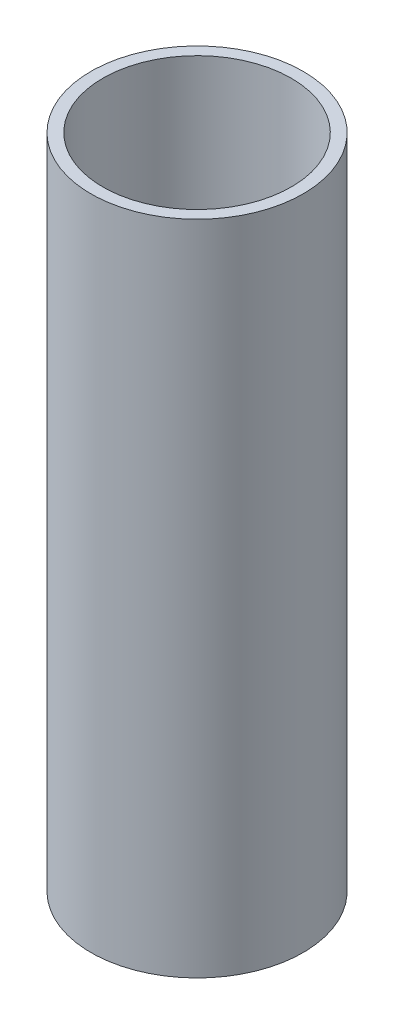
ISO-10303-21;
HEADER;
FILE_DESCRIPTION(('STEP AP214'),'2;1');
FILE_NAME('part.step','',(''),(''),'','','');
FILE_SCHEMA(('AUTOMOTIVE_DESIGN { 1 0 10303 214 1 1 1 1 }'));
ENDSEC;
DATA;
#1=APPLICATION_CONTEXT('core data for automotive mechanical design processes');
#2=APPLICATION_PROTOCOL_DEFINITION('international standard','automotive_design',2000,#1);
#3=PRODUCT_CONTEXT('',#1,'mechanical');
#4=PRODUCT('Part','Part','',(#3));
#5=PRODUCT_RELATED_PRODUCT_CATEGORY('part','',(#4));
#6=PRODUCT_DEFINITION_FORMATION('','',#4);
#7=PRODUCT_DEFINITION_CONTEXT('part definition',#1,'design');
#8=PRODUCT_DEFINITION('design','',#6,#7);
#9=PRODUCT_DEFINITION_SHAPE('','',#8);
#10=(LENGTH_UNIT() NAMED_UNIT(*) SI_UNIT(.MILLI.,.METRE.));
#11=(NAMED_UNIT(*) PLANE_ANGLE_UNIT() SI_UNIT($,.RADIAN.));
#12=(NAMED_UNIT(*) SI_UNIT($,.STERADIAN.) SOLID_ANGLE_UNIT());
#13=UNCERTAINTY_MEASURE_WITH_UNIT(LENGTH_MEASURE(1.E-05),#10,'distance_accuracy_value','');
#14=(GEOMETRIC_REPRESENTATION_CONTEXT(3) GLOBAL_UNCERTAINTY_ASSIGNED_CONTEXT((#13)) GLOBAL_UNIT_ASSIGNED_CONTEXT((#10,
#11,#12)) REPRESENTATION_CONTEXT('',''));
#15=CARTESIAN_POINT('',(0.,0.,0.));
#16=DIRECTION('',(0.,0.,1.));
#17=DIRECTION('',(1.,0.,0.));
#18=AXIS2_PLACEMENT_3D('',#15,#16,#17);
#19=CARTESIAN_POINT('',(13.6326591615901,49.14,-6.07942908557396));
#20=DIRECTION('',(0.,1.,0.));
#21=DIRECTION('',(0.,0.,1.));
#22=AXIS2_PLACEMENT_3D('',#19,#20,#21);
#23=PLANE('',#22);
#24=CARTESIAN_POINT('',(13.6326591615901,49.14,-6.07942908557396));
#25=DIRECTION('',(0.,1.,0.));
#26=DIRECTION('',(0.,0.,1.));
#27=AXIS2_PLACEMENT_3D('',#24,#25,#26);
#28=CIRCLE('',#27,7.9375);
#29=CARTESIAN_POINT('',(13.6326591615901,49.14,-14.016929085574));
#30=VERTEX_POINT('',#29);
#31=EDGE_CURVE('E10',#30,#30,#28,.T.);
#32=ORIENTED_EDGE('',*,*,#31,.T.);
#33=EDGE_LOOP('',(#32));
#34=FACE_BOUND('',#33,.T.);
#35=CARTESIAN_POINT('',(13.6326591615901,49.14,-6.07942908557396));
#36=DIRECTION('',(0.,1.,0.));
#37=DIRECTION('',(0.,0.,1.));
#38=AXIS2_PLACEMENT_3D('',#35,#36,#37);
#39=CIRCLE('',#38,7.0485);
#40=CARTESIAN_POINT('',(13.6326591615901,49.14,-13.127929085574));
#41=VERTEX_POINT('',#40);
#42=EDGE_CURVE('E42',#41,#41,#39,.T.);
#43=ORIENTED_EDGE('',*,*,#42,.F.);
#44=EDGE_LOOP('',(#43));
#45=FACE_BOUND('',#44,.T.);
#46=ADVANCED_FACE('F31',(#34,#45),#23,.T.);
#47=CARTESIAN_POINT('',(13.6326591615901,0.,-6.07942908557396));
#48=DIRECTION('',(0.,1.,0.));
#49=DIRECTION('',(0.,0.,1.));
#50=AXIS2_PLACEMENT_3D('',#47,#48,#49);
#51=PLANE('',#50);
#52=CARTESIAN_POINT('',(13.6326591615901,0.,-6.07942908557396));
#53=DIRECTION('',(0.,1.,0.));
#54=DIRECTION('',(0.,0.,1.));
#55=AXIS2_PLACEMENT_3D('',#52,#53,#54);
#56=CIRCLE('',#55,7.9375);
#57=CARTESIAN_POINT('',(13.6326591615901,0.,-14.016929085574));
#58=VERTEX_POINT('',#57);
#59=EDGE_CURVE('E35',#58,#58,#56,.T.);
#60=ORIENTED_EDGE('',*,*,#59,.F.);
#61=EDGE_LOOP('',(#60));
#62=FACE_BOUND('',#61,.T.);
#63=CARTESIAN_POINT('',(13.6326591615901,0.,-6.07942908557396));
#64=DIRECTION('',(0.,1.,0.));
#65=DIRECTION('',(0.,0.,1.));
#66=AXIS2_PLACEMENT_3D('',#63,#64,#65);
#67=CIRCLE('',#66,7.0485);
#68=CARTESIAN_POINT('',(13.6326591615901,0.,-13.127929085574));
#69=VERTEX_POINT('',#68);
#70=EDGE_CURVE('E44',#69,#69,#67,.T.);
#71=ORIENTED_EDGE('',*,*,#70,.T.);
#72=EDGE_LOOP('',(#71));
#73=FACE_BOUND('',#72,.T.);
#74=ADVANCED_FACE('F54',(#62,#73),#51,.F.);
#75=CARTESIAN_POINT('',(13.6326591615901,49.14,-6.07942908557396));
#76=DIRECTION('',(0.,-1.,0.));
#77=DIRECTION('',(0.,0.,-1.));
#78=AXIS2_PLACEMENT_3D('',#75,#76,#77);
#79=CYLINDRICAL_SURFACE('',#78,7.9375);
#80=CARTESIAN_POINT('',(13.6326591615901,49.14,-14.016929085574));
#81=CARTESIAN_POINT('',(13.6326591615901,48.628125,-14.016929085574));
#82=CARTESIAN_POINT('',(13.6326591615901,48.11625,-14.016929085574));
#83=CARTESIAN_POINT('',(13.6326591615901,47.0925,-14.016929085574));
#84=CARTESIAN_POINT('',(13.6326591615901,46.580625,-14.016929085574));
#85=CARTESIAN_POINT('',(13.6326591615901,45.556875,-14.016929085574));
#86=CARTESIAN_POINT('',(13.6326591615901,45.045,-14.016929085574));
#87=CARTESIAN_POINT('',(13.6326591615901,44.02125,-14.016929085574));
#88=CARTESIAN_POINT('',(13.6326591615901,43.509375,-14.016929085574));
#89=CARTESIAN_POINT('',(13.6326591615901,42.485625,-14.016929085574));
#90=CARTESIAN_POINT('',(13.6326591615901,41.97375,-14.016929085574));
#91=CARTESIAN_POINT('',(13.6326591615901,40.95,-14.016929085574));
#92=CARTESIAN_POINT('',(13.6326591615901,40.438125,-14.016929085574));
#93=CARTESIAN_POINT('',(13.6326591615901,39.414375,-14.016929085574));
#94=CARTESIAN_POINT('',(13.6326591615901,38.9025,-14.016929085574));
#95=CARTESIAN_POINT('',(13.6326591615901,37.87875,-14.016929085574));
#96=CARTESIAN_POINT('',(13.6326591615901,37.366875,-14.016929085574));
#97=CARTESIAN_POINT('',(13.6326591615901,36.343125,-14.016929085574));
#98=CARTESIAN_POINT('',(13.6326591615901,35.83125,-14.016929085574));
#99=CARTESIAN_POINT('',(13.6326591615901,34.8075,-14.016929085574));
#100=CARTESIAN_POINT('',(13.6326591615901,34.295625,-14.016929085574));
#101=CARTESIAN_POINT('',(13.6326591615901,33.271875,-14.016929085574));
#102=CARTESIAN_POINT('',(13.6326591615901,32.76,-14.016929085574));
#103=CARTESIAN_POINT('',(13.6326591615901,31.73625,-14.016929085574));
#104=CARTESIAN_POINT('',(13.6326591615901,31.224375,-14.016929085574));
#105=CARTESIAN_POINT('',(13.6326591615901,30.200625,-14.016929085574));
#106=CARTESIAN_POINT('',(13.6326591615901,29.68875,-14.016929085574));
#107=CARTESIAN_POINT('',(13.6326591615901,28.665,-14.016929085574));
#108=CARTESIAN_POINT('',(13.6326591615901,28.153125,-14.016929085574));
#109=CARTESIAN_POINT('',(13.6326591615901,27.129375,-14.016929085574));
#110=CARTESIAN_POINT('',(13.6326591615901,26.6175,-14.016929085574));
#111=CARTESIAN_POINT('',(13.6326591615901,25.59375,-14.016929085574));
#112=CARTESIAN_POINT('',(13.6326591615901,25.081875,-14.016929085574));
#113=CARTESIAN_POINT('',(13.6326591615901,24.058125,-14.016929085574));
#114=CARTESIAN_POINT('',(13.6326591615901,23.54625,-14.016929085574));
#115=CARTESIAN_POINT('',(13.6326591615901,22.5225,-14.016929085574));
#116=CARTESIAN_POINT('',(13.6326591615901,22.010625,-14.016929085574));
#117=CARTESIAN_POINT('',(13.6326591615901,20.986875,-14.016929085574));
#118=CARTESIAN_POINT('',(13.6326591615901,20.475,-14.016929085574));
#119=CARTESIAN_POINT('',(13.6326591615901,19.45125,-14.016929085574));
#120=CARTESIAN_POINT('',(13.6326591615901,18.939375,-14.016929085574));
#121=CARTESIAN_POINT('',(13.6326591615901,17.915625,-14.016929085574));
#122=CARTESIAN_POINT('',(13.6326591615901,17.40375,-14.016929085574));
#123=CARTESIAN_POINT('',(13.6326591615901,16.38,-14.016929085574));
#124=CARTESIAN_POINT('',(13.6326591615901,15.868125,-14.016929085574));
#125=CARTESIAN_POINT('',(13.6326591615901,14.844375,-14.016929085574));
#126=CARTESIAN_POINT('',(13.6326591615901,14.3325,-14.016929085574));
#127=CARTESIAN_POINT('',(13.6326591615901,13.30875,-14.016929085574));
#128=CARTESIAN_POINT('',(13.6326591615901,12.796875,-14.016929085574));
#129=CARTESIAN_POINT('',(13.6326591615901,11.773125,-14.016929085574));
#130=CARTESIAN_POINT('',(13.6326591615901,11.26125,-14.016929085574));
#131=CARTESIAN_POINT('',(13.6326591615901,10.2375,-14.016929085574));
#132=CARTESIAN_POINT('',(13.6326591615901,9.725625,-14.016929085574));
#133=CARTESIAN_POINT('',(13.6326591615901,8.70187499999999,-14.016929085574));
#134=CARTESIAN_POINT('',(13.6326591615901,8.18999999999999,-14.016929085574));
#135=CARTESIAN_POINT('',(13.6326591615901,7.16624999999999,-14.016929085574));
#136=CARTESIAN_POINT('',(13.6326591615901,6.65437499999999,-14.016929085574));
#137=CARTESIAN_POINT('',(13.6326591615901,5.630625,-14.016929085574));
#138=CARTESIAN_POINT('',(13.6326591615901,5.11875,-14.016929085574));
#139=CARTESIAN_POINT('',(13.6326591615901,4.09499999999999,-14.016929085574));
#140=CARTESIAN_POINT('',(13.6326591615901,3.58312499999999,-14.016929085574));
#141=CARTESIAN_POINT('',(13.6326591615901,2.55937499999999,-14.016929085574));
#142=CARTESIAN_POINT('',(13.6326591615901,2.04749999999999,-14.016929085574));
#143=CARTESIAN_POINT('',(13.6326591615901,1.02374999999999,-14.016929085574));
#144=CARTESIAN_POINT('',(13.6326591615901,0.511874999999993,-14.016929085574));
#145=CARTESIAN_POINT('',(13.6326591615901,0.,-14.016929085574));
#146=B_SPLINE_CURVE_WITH_KNOTS('',3,(#80,#81,#82,#83,#84,#85,#86,#87,#88,#89,#90,#91,#92,#93,
#94,#95,#96,#97,#98,#99,#100,#101,#102,#103,#104,#105,#106,#107,#108,#109,#110,#111,#112,#113,
#114,#115,#116,#117,#118,#119,#120,#121,#122,#123,#124,#125,#126,#127,#128,#129,#130,#131,#132,
#133,#134,#135,#136,#137,#138,#139,#140,#141,#142,#143,#144,#145),.UNSPECIFIED.,.F.,.F.,(4,2,2,
2,2,2,2,2,2,2,2,2,2,2,2,2,2,2,2,2,2,2,2,2,2,2,2,2,2,2,2,2,4),(0.,1.535625,3.07125,4.606875,
6.14249999999999,7.678125,9.21375,10.749375,12.285,13.820625,15.35625,16.891875,18.4275,
19.963125,21.49875,23.034375,24.57,26.105625,27.64125,29.176875,30.7125,32.248125,33.78375,
35.319375,36.855,38.390625,39.92625,41.461875,42.9975,44.533125,46.06875,47.604375,49.14),.UNSPECIFIED.);
#147=EDGE_CURVE('BSEAM33',#30,#58,#146,.T.);
#148=ORIENTED_EDGE('',*,*,#31,.F.);
#149=ORIENTED_EDGE('',*,*,#59,.T.);
#150=ORIENTED_EDGE('',*,*,#147,.T.);
#151=ORIENTED_EDGE('',*,*,#147,.F.);
#152=EDGE_LOOP('',(#148,#150,#149,#151));
#153=FACE_BOUND('',#152,.T.);
#154=ADVANCED_FACE('F33',(#153),#79,.T.);
#155=CARTESIAN_POINT('',(13.6326591615901,49.14,-6.07942908557396));
#156=DIRECTION('',(0.,-1.,0.));
#157=DIRECTION('',(0.,0.,-1.));
#158=AXIS2_PLACEMENT_3D('',#155,#156,#157);
#159=CYLINDRICAL_SURFACE('',#158,7.0485);
#160=CARTESIAN_POINT('',(13.6326591615901,49.14,-13.127929085574));
#161=CARTESIAN_POINT('',(13.6326591615901,48.628125,-13.127929085574));
#162=CARTESIAN_POINT('',(13.6326591615901,48.11625,-13.127929085574));
#163=CARTESIAN_POINT('',(13.6326591615901,47.0925,-13.127929085574));
#164=CARTESIAN_POINT('',(13.6326591615901,46.580625,-13.127929085574));
#165=CARTESIAN_POINT('',(13.6326591615901,45.556875,-13.127929085574));
#166=CARTESIAN_POINT('',(13.6326591615901,45.045,-13.127929085574));
#167=CARTESIAN_POINT('',(13.6326591615901,44.02125,-13.127929085574));
#168=CARTESIAN_POINT('',(13.6326591615901,43.509375,-13.127929085574));
#169=CARTESIAN_POINT('',(13.6326591615901,42.485625,-13.127929085574));
#170=CARTESIAN_POINT('',(13.6326591615901,41.97375,-13.127929085574));
#171=CARTESIAN_POINT('',(13.6326591615901,40.95,-13.127929085574));
#172=CARTESIAN_POINT('',(13.6326591615901,40.438125,-13.127929085574));
#173=CARTESIAN_POINT('',(13.6326591615901,39.414375,-13.127929085574));
#174=CARTESIAN_POINT('',(13.6326591615901,38.9025,-13.127929085574));
#175=CARTESIAN_POINT('',(13.6326591615901,37.87875,-13.127929085574));
#176=CARTESIAN_POINT('',(13.6326591615901,37.366875,-13.127929085574));
#177=CARTESIAN_POINT('',(13.6326591615901,36.343125,-13.127929085574));
#178=CARTESIAN_POINT('',(13.6326591615901,35.83125,-13.127929085574));
#179=CARTESIAN_POINT('',(13.6326591615901,34.8075,-13.127929085574));
#180=CARTESIAN_POINT('',(13.6326591615901,34.295625,-13.127929085574));
#181=CARTESIAN_POINT('',(13.6326591615901,33.271875,-13.127929085574));
#182=CARTESIAN_POINT('',(13.6326591615901,32.76,-13.127929085574));
#183=CARTESIAN_POINT('',(13.6326591615901,31.73625,-13.127929085574));
#184=CARTESIAN_POINT('',(13.6326591615901,31.224375,-13.127929085574));
#185=CARTESIAN_POINT('',(13.6326591615901,30.200625,-13.127929085574));
#186=CARTESIAN_POINT('',(13.6326591615901,29.68875,-13.127929085574));
#187=CARTESIAN_POINT('',(13.6326591615901,28.665,-13.127929085574));
#188=CARTESIAN_POINT('',(13.6326591615901,28.153125,-13.127929085574));
#189=CARTESIAN_POINT('',(13.6326591615901,27.129375,-13.127929085574));
#190=CARTESIAN_POINT('',(13.6326591615901,26.6175,-13.127929085574));
#191=CARTESIAN_POINT('',(13.6326591615901,25.59375,-13.127929085574));
#192=CARTESIAN_POINT('',(13.6326591615901,25.081875,-13.127929085574));
#193=CARTESIAN_POINT('',(13.6326591615901,24.058125,-13.127929085574));
#194=CARTESIAN_POINT('',(13.6326591615901,23.54625,-13.127929085574));
#195=CARTESIAN_POINT('',(13.6326591615901,22.5225,-13.127929085574));
#196=CARTESIAN_POINT('',(13.6326591615901,22.010625,-13.127929085574));
#197=CARTESIAN_POINT('',(13.6326591615901,20.986875,-13.127929085574));
#198=CARTESIAN_POINT('',(13.6326591615901,20.475,-13.127929085574));
#199=CARTESIAN_POINT('',(13.6326591615901,19.45125,-13.127929085574));
#200=CARTESIAN_POINT('',(13.6326591615901,18.939375,-13.127929085574));
#201=CARTESIAN_POINT('',(13.6326591615901,17.915625,-13.127929085574));
#202=CARTESIAN_POINT('',(13.6326591615901,17.40375,-13.127929085574));
#203=CARTESIAN_POINT('',(13.6326591615901,16.38,-13.127929085574));
#204=CARTESIAN_POINT('',(13.6326591615901,15.868125,-13.127929085574));
#205=CARTESIAN_POINT('',(13.6326591615901,14.844375,-13.127929085574));
#206=CARTESIAN_POINT('',(13.6326591615901,14.3325,-13.127929085574));
#207=CARTESIAN_POINT('',(13.6326591615901,13.30875,-13.127929085574));
#208=CARTESIAN_POINT('',(13.6326591615901,12.796875,-13.127929085574));
#209=CARTESIAN_POINT('',(13.6326591615901,11.773125,-13.127929085574));
#210=CARTESIAN_POINT('',(13.6326591615901,11.26125,-13.127929085574));
#211=CARTESIAN_POINT('',(13.6326591615901,10.2375,-13.127929085574));
#212=CARTESIAN_POINT('',(13.6326591615901,9.725625,-13.127929085574));
#213=CARTESIAN_POINT('',(13.6326591615901,8.70187499999999,-13.127929085574));
#214=CARTESIAN_POINT('',(13.6326591615901,8.18999999999999,-13.127929085574));
#215=CARTESIAN_POINT('',(13.6326591615901,7.16624999999999,-13.127929085574));
#216=CARTESIAN_POINT('',(13.6326591615901,6.65437499999999,-13.127929085574));
#217=CARTESIAN_POINT('',(13.6326591615901,5.630625,-13.127929085574));
#218=CARTESIAN_POINT('',(13.6326591615901,5.11875,-13.127929085574));
#219=CARTESIAN_POINT('',(13.6326591615901,4.09499999999999,-13.127929085574));
#220=CARTESIAN_POINT('',(13.6326591615901,3.58312499999999,-13.127929085574));
#221=CARTESIAN_POINT('',(13.6326591615901,2.55937499999999,-13.127929085574));
#222=CARTESIAN_POINT('',(13.6326591615901,2.04749999999999,-13.127929085574));
#223=CARTESIAN_POINT('',(13.6326591615901,1.02374999999999,-13.127929085574));
#224=CARTESIAN_POINT('',(13.6326591615901,0.511874999999993,-13.127929085574));
#225=CARTESIAN_POINT('',(13.6326591615901,0.,-13.127929085574));
#226=B_SPLINE_CURVE_WITH_KNOTS('',3,(#160,#161,#162,#163,#164,#165,#166,#167,#168,#169,#170,
#171,#172,#173,#174,#175,#176,#177,#178,#179,#180,#181,#182,#183,#184,#185,#186,#187,#188,#189,
#190,#191,#192,#193,#194,#195,#196,#197,#198,#199,#200,#201,#202,#203,#204,#205,#206,#207,#208,
#209,#210,#211,#212,#213,#214,#215,#216,#217,#218,#219,#220,#221,#222,#223,#224,#225),
.UNSPECIFIED.,.F.,.F.,(4,2,2,2,2,2,2,2,2,2,2,2,2,2,2,2,2,2,2,2,2,2,2,2,2,2,2,2,2,2,2,2,4),(0.,
1.535625,3.07125,4.606875,6.14249999999999,7.678125,9.21375,10.749375,12.285,13.820625,15.35625,
16.891875,18.4275,19.963125,21.49875,23.034375,24.57,26.105625,27.64125,29.176875,30.7125,
32.248125,33.78375,35.319375,36.855,38.390625,39.92625,41.461875,42.9975,44.533125,46.06875,
47.604375,49.14),.UNSPECIFIED.);
#227=EDGE_CURVE('BSEAM50',#41,#69,#226,.T.);
#228=ORIENTED_EDGE('',*,*,#42,.T.);
#229=ORIENTED_EDGE('',*,*,#70,.F.);
#230=ORIENTED_EDGE('',*,*,#227,.T.);
#231=ORIENTED_EDGE('',*,*,#227,.F.);
#232=EDGE_LOOP('',(#228,#230,#229,#231));
#233=FACE_BOUND('',#232,.T.);
#234=ADVANCED_FACE('F50',(#233),#159,.F.);
#235=CLOSED_SHELL('',(#46,#74,#154,#234));
#236=MANIFOLD_SOLID_BREP('B2',#235);
#237=ADVANCED_BREP_SHAPE_REPRESENTATION('',(#18,#236),#14);
#238=SHAPE_DEFINITION_REPRESENTATION(#9,#237);
ENDSEC;
END-ISO-10303-21;
